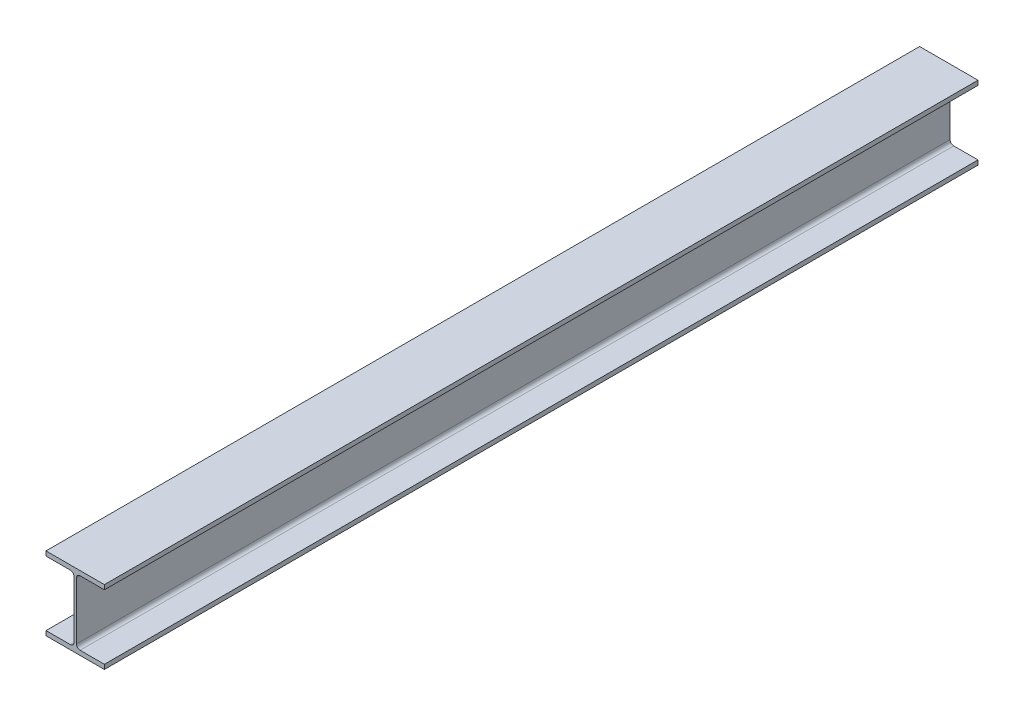
ISO-10303-21;
HEADER;
FILE_DESCRIPTION(('STEP AP214'),'2;1');
FILE_NAME('part.step','',(''),(''),'','','');
FILE_SCHEMA(('AUTOMOTIVE_DESIGN { 1 0 10303 214 1 1 1 1 }'));
ENDSEC;
DATA;
#1=APPLICATION_CONTEXT('core data for automotive mechanical design processes');
#2=APPLICATION_PROTOCOL_DEFINITION('international standard','automotive_design',2000,#1);
#3=PRODUCT_CONTEXT('',#1,'mechanical');
#4=PRODUCT('Part','Part','',(#3));
#5=PRODUCT_RELATED_PRODUCT_CATEGORY('part','',(#4));
#6=PRODUCT_DEFINITION_FORMATION('','',#4);
#7=PRODUCT_DEFINITION_CONTEXT('part definition',#1,'design');
#8=PRODUCT_DEFINITION('design','',#6,#7);
#9=PRODUCT_DEFINITION_SHAPE('','',#8);
#10=(LENGTH_UNIT() NAMED_UNIT(*) SI_UNIT(.MILLI.,.METRE.));
#11=(NAMED_UNIT(*) PLANE_ANGLE_UNIT() SI_UNIT($,.RADIAN.));
#12=(NAMED_UNIT(*) SI_UNIT($,.STERADIAN.) SOLID_ANGLE_UNIT());
#13=UNCERTAINTY_MEASURE_WITH_UNIT(LENGTH_MEASURE(1.E-05),#10,'distance_accuracy_value','');
#14=(GEOMETRIC_REPRESENTATION_CONTEXT(3) GLOBAL_UNCERTAINTY_ASSIGNED_CONTEXT((#13)) GLOBAL_UNIT_ASSIGNED_CONTEXT((#10,
#11,#12)) REPRESENTATION_CONTEXT('',''));
#15=CARTESIAN_POINT('',(0.,0.,0.));
#16=DIRECTION('',(0.,0.,1.));
#17=DIRECTION('',(1.,0.,0.));
#18=AXIS2_PLACEMENT_3D('',#15,#16,#17);
#19=CARTESIAN_POINT('',(203.708,0.,-1524.));
#20=DIRECTION('',(0.,-1.,0.));
#21=DIRECTION('',(0.,0.,-1.));
#22=AXIS2_PLACEMENT_3D('',#19,#20,#21);
#23=PLANE('',#22);
#24=DIRECTION('',(1.,0.,0.));
#25=VECTOR('',#24,1.);
#26=CARTESIAN_POINT('',(203.708,0.,1524.));
#27=LINE('',#26,#25);
#28=CARTESIAN_POINT('',(0.,0.,1524.));
#29=VERTEX_POINT('',#28);
#30=CARTESIAN_POINT('',(203.708,0.,1524.));
#31=VERTEX_POINT('',#30);
#32=EDGE_CURVE('E177',#29,#31,#27,.T.);
#33=ORIENTED_EDGE('',*,*,#32,.F.);
#34=DIRECTION('',(0.,0.,1.));
#35=VECTOR('',#34,1.);
#36=CARTESIAN_POINT('',(0.,0.,-1524.));
#37=LINE('',#36,#35);
#38=CARTESIAN_POINT('',(0.,0.,-1524.));
#39=VERTEX_POINT('',#38);
#40=EDGE_CURVE('E11',#39,#29,#37,.T.);
#41=ORIENTED_EDGE('',*,*,#40,.F.);
#42=DIRECTION('',(1.,0.,0.));
#43=VECTOR('',#42,1.);
#44=CARTESIAN_POINT('',(203.708,0.,-1524.));
#45=LINE('',#44,#43);
#46=CARTESIAN_POINT('',(203.708,0.,-1524.));
#47=VERTEX_POINT('',#46);
#48=EDGE_CURVE('E221',#39,#47,#45,.T.);
#49=ORIENTED_EDGE('',*,*,#48,.T.);
#50=DIRECTION('',(0.,0.,1.));
#51=VECTOR('',#50,1.);
#52=CARTESIAN_POINT('',(203.708,0.,-1524.));
#53=LINE('',#52,#51);
#54=EDGE_CURVE('E35',#47,#31,#53,.T.);
#55=ORIENTED_EDGE('',*,*,#54,.T.);
#56=EDGE_LOOP('',(#33,#41,#49,#55));
#57=FACE_BOUND('',#56,.T.);
#58=ADVANCED_FACE('F32',(#57),#23,.T.);
#59=CARTESIAN_POINT('',(0.,0.,-1524.));
#60=DIRECTION('',(-1.,0.,0.));
#61=DIRECTION('',(0.,-1.,0.));
#62=AXIS2_PLACEMENT_3D('',#59,#60,#61);
#63=PLANE('',#62);
#64=DIRECTION('',(0.,-1.,0.));
#65=VECTOR('',#64,1.);
#66=CARTESIAN_POINT('',(0.,0.,1524.));
#67=LINE('',#66,#65);
#68=CARTESIAN_POINT('',(0.,15.748,1524.));
#69=VERTEX_POINT('',#68);
#70=EDGE_CURVE('E219',#69,#29,#67,.T.);
#71=ORIENTED_EDGE('',*,*,#70,.F.);
#72=DIRECTION('',(0.,0.,1.));
#73=VECTOR('',#72,1.);
#74=CARTESIAN_POINT('',(0.,15.748,-1524.));
#75=LINE('',#74,#73);
#76=CARTESIAN_POINT('',(0.,15.748,-1524.));
#77=VERTEX_POINT('',#76);
#78=EDGE_CURVE('E41',#77,#69,#75,.T.);
#79=ORIENTED_EDGE('',*,*,#78,.F.);
#80=DIRECTION('',(0.,-1.,0.));
#81=VECTOR('',#80,1.);
#82=CARTESIAN_POINT('',(0.,0.,-1524.));
#83=LINE('',#82,#81);
#84=EDGE_CURVE('E167',#77,#39,#83,.T.);
#85=ORIENTED_EDGE('',*,*,#84,.T.);
#86=ORIENTED_EDGE('',*,*,#40,.T.);
#87=EDGE_LOOP('',(#71,#79,#85,#86));
#88=FACE_BOUND('',#87,.T.);
#89=ADVANCED_FACE('F249',(#88),#63,.T.);
#90=CARTESIAN_POINT('',(0.,15.748,-1524.));
#91=DIRECTION('',(0.,1.,0.));
#92=DIRECTION('',(-1.,0.,0.));
#93=AXIS2_PLACEMENT_3D('',#90,#91,#92);
#94=PLANE('',#93);
#95=DIRECTION('',(-1.,0.,0.));
#96=VECTOR('',#95,1.);
#97=CARTESIAN_POINT('',(0.,15.748,1524.));
#98=LINE('',#97,#96);
#99=CARTESIAN_POINT('',(84.709,15.748,1524.));
#100=VERTEX_POINT('',#99);
#101=EDGE_CURVE('E154',#100,#69,#98,.T.);
#102=ORIENTED_EDGE('',*,*,#101,.F.);
#103=DIRECTION('',(0.,0.,1.));
#104=VECTOR('',#103,1.);
#105=CARTESIAN_POINT('',(84.709,15.748,-1524.));
#106=LINE('',#105,#104);
#107=CARTESIAN_POINT('',(84.709,15.748,-1524.));
#108=VERTEX_POINT('',#107);
#109=EDGE_CURVE('E149',#108,#100,#106,.T.);
#110=ORIENTED_EDGE('',*,*,#109,.F.);
#111=DIRECTION('',(-1.,0.,0.));
#112=VECTOR('',#111,1.);
#113=CARTESIAN_POINT('',(0.,15.748,-1524.));
#114=LINE('',#113,#112);
#115=EDGE_CURVE('E152',#108,#77,#114,.T.);
#116=ORIENTED_EDGE('',*,*,#115,.T.);
#117=ORIENTED_EDGE('',*,*,#78,.T.);
#118=EDGE_LOOP('',(#102,#110,#116,#117));
#119=FACE_BOUND('',#118,.T.);
#120=ADVANCED_FACE('F151',(#119),#94,.T.);
#121=CARTESIAN_POINT('',(84.709,28.448,-1524.));
#122=DIRECTION('',(0.,0.,1.));
#123=DIRECTION('',(1.,0.,0.));
#124=AXIS2_PLACEMENT_3D('',#121,#122,#123);
#125=CYLINDRICAL_SURFACE('',#124,12.7);
#126=CARTESIAN_POINT('',(84.709,28.448,1524.));
#127=DIRECTION('',(0.,0.,-1.));
#128=DIRECTION('',(1.,0.,0.));
#129=AXIS2_PLACEMENT_3D('',#126,#127,#128);
#130=CIRCLE('',#129,12.7);
#131=CARTESIAN_POINT('',(97.409,28.448,1524.));
#132=VERTEX_POINT('',#131);
#133=EDGE_CURVE('E216',#132,#100,#130,.T.);
#134=ORIENTED_EDGE('',*,*,#133,.F.);
#135=DIRECTION('',(0.,0.,1.));
#136=VECTOR('',#135,1.);
#137=CARTESIAN_POINT('',(97.409,28.448,-1524.));
#138=LINE('',#137,#136);
#139=CARTESIAN_POINT('',(97.409,28.448,-1524.));
#140=VERTEX_POINT('',#139);
#141=EDGE_CURVE('E159',#140,#132,#138,.T.);
#142=ORIENTED_EDGE('',*,*,#141,.F.);
#143=CARTESIAN_POINT('',(84.709,28.448,-1524.));
#144=DIRECTION('',(0.,0.,-1.));
#145=DIRECTION('',(1.,0.,0.));
#146=AXIS2_PLACEMENT_3D('',#143,#144,#145);
#147=CIRCLE('',#146,12.7);
#148=EDGE_CURVE('E165',#140,#108,#147,.T.);
#149=ORIENTED_EDGE('',*,*,#148,.T.);
#150=ORIENTED_EDGE('',*,*,#109,.T.);
#151=EDGE_LOOP('',(#134,#142,#149,#150));
#152=FACE_BOUND('',#151,.T.);
#153=ADVANCED_FACE('F169',(#152),#125,.F.);
#154=CARTESIAN_POINT('',(97.409,28.448,-1524.));
#155=DIRECTION('',(-1.,0.,0.));
#156=DIRECTION('',(0.,-1.,0.));
#157=AXIS2_PLACEMENT_3D('',#154,#155,#156);
#158=PLANE('',#157);
#159=DIRECTION('',(0.,-1.,0.));
#160=VECTOR('',#159,1.);
#161=CARTESIAN_POINT('',(97.409,28.448,1524.));
#162=LINE('',#161,#160);
#163=CARTESIAN_POINT('',(97.4089999999999,228.092,1524.));
#164=VERTEX_POINT('',#163);
#165=EDGE_CURVE('E213',#164,#132,#162,.T.);
#166=ORIENTED_EDGE('',*,*,#165,.F.);
#167=DIRECTION('',(0.,0.,1.));
#168=VECTOR('',#167,1.);
#169=CARTESIAN_POINT('',(97.4089999999999,228.092,-1524.));
#170=LINE('',#169,#168);
#171=CARTESIAN_POINT('',(97.4089999999999,228.092,-1524.));
#172=VERTEX_POINT('',#171);
#173=EDGE_CURVE('E225',#172,#164,#170,.T.);
#174=ORIENTED_EDGE('',*,*,#173,.F.);
#175=DIRECTION('',(0.,-1.,0.));
#176=VECTOR('',#175,1.);
#177=CARTESIAN_POINT('',(97.409,28.448,-1524.));
#178=LINE('',#177,#176);
#179=EDGE_CURVE('E170',#172,#140,#178,.T.);
#180=ORIENTED_EDGE('',*,*,#179,.T.);
#181=ORIENTED_EDGE('',*,*,#141,.T.);
#182=EDGE_LOOP('',(#166,#174,#180,#181));
#183=FACE_BOUND('',#182,.T.);
#184=ADVANCED_FACE('F262',(#183),#158,.T.);
#185=CARTESIAN_POINT('',(84.7089999999999,228.092,-1524.));
#186=DIRECTION('',(0.,0.,1.));
#187=DIRECTION('',(1.,0.,0.));
#188=AXIS2_PLACEMENT_3D('',#185,#186,#187);
#189=CYLINDRICAL_SURFACE('',#188,12.7);
#190=CARTESIAN_POINT('',(84.7089999999999,228.092,1524.));
#191=DIRECTION('',(0.,0.,-1.));
#192=DIRECTION('',(1.,0.,0.));
#193=AXIS2_PLACEMENT_3D('',#190,#191,#192);
#194=CIRCLE('',#193,12.7);
#195=CARTESIAN_POINT('',(84.7089999999999,240.792,1524.));
#196=VERTEX_POINT('',#195);
#197=EDGE_CURVE('E210',#196,#164,#194,.T.);
#198=ORIENTED_EDGE('',*,*,#197,.F.);
#199=DIRECTION('',(0.,0.,1.));
#200=VECTOR('',#199,1.);
#201=CARTESIAN_POINT('',(84.7089999999999,240.792,-1524.));
#202=LINE('',#201,#200);
#203=CARTESIAN_POINT('',(84.7089999999999,240.792,-1524.));
#204=VERTEX_POINT('',#203);
#205=EDGE_CURVE('E227',#204,#196,#202,.T.);
#206=ORIENTED_EDGE('',*,*,#205,.F.);
#207=CARTESIAN_POINT('',(84.7089999999999,228.092,-1524.));
#208=DIRECTION('',(0.,0.,-1.));
#209=DIRECTION('',(1.,0.,0.));
#210=AXIS2_PLACEMENT_3D('',#207,#208,#209);
#211=CIRCLE('',#210,12.7);
#212=EDGE_CURVE('E172',#204,#172,#211,.T.);
#213=ORIENTED_EDGE('',*,*,#212,.T.);
#214=ORIENTED_EDGE('',*,*,#173,.T.);
#215=EDGE_LOOP('',(#198,#206,#213,#214));
#216=FACE_BOUND('',#215,.T.);
#217=ADVANCED_FACE('F265',(#216),#189,.F.);
#218=CARTESIAN_POINT('',(84.7089999999999,240.792,-1524.));
#219=DIRECTION('',(0.,-1.,0.));
#220=DIRECTION('',(0.,0.,-1.));
#221=AXIS2_PLACEMENT_3D('',#218,#219,#220);
#222=PLANE('',#221);
#223=DIRECTION('',(1.,0.,0.));
#224=VECTOR('',#223,1.);
#225=CARTESIAN_POINT('',(84.7089999999999,240.792,1524.));
#226=LINE('',#225,#224);
#227=CARTESIAN_POINT('',(0.,240.792,1524.));
#228=VERTEX_POINT('',#227);
#229=EDGE_CURVE('E207',#228,#196,#226,.T.);
#230=ORIENTED_EDGE('',*,*,#229,.F.);
#231=DIRECTION('',(0.,0.,1.));
#232=VECTOR('',#231,1.);
#233=CARTESIAN_POINT('',(0.,240.792,-1524.));
#234=LINE('',#233,#232);
#235=CARTESIAN_POINT('',(0.,240.792,-1524.));
#236=VERTEX_POINT('',#235);
#237=EDGE_CURVE('E229',#236,#228,#234,.T.);
#238=ORIENTED_EDGE('',*,*,#237,.F.);
#239=DIRECTION('',(1.,0.,0.));
#240=VECTOR('',#239,1.);
#241=CARTESIAN_POINT('',(84.7089999999999,240.792,-1524.));
#242=LINE('',#241,#240);
#243=EDGE_CURVE('E446',#236,#204,#242,.T.);
#244=ORIENTED_EDGE('',*,*,#243,.T.);
#245=ORIENTED_EDGE('',*,*,#205,.T.);
#246=EDGE_LOOP('',(#230,#238,#244,#245));
#247=FACE_BOUND('',#246,.T.);
#248=ADVANCED_FACE('F269',(#247),#222,.T.);
#249=CARTESIAN_POINT('',(0.,240.792,-1524.));
#250=DIRECTION('',(-1.,0.,0.));
#251=DIRECTION('',(0.,-1.,0.));
#252=AXIS2_PLACEMENT_3D('',#249,#250,#251);
#253=PLANE('',#252);
#254=DIRECTION('',(0.,-1.,0.));
#255=VECTOR('',#254,1.);
#256=CARTESIAN_POINT('',(0.,240.792,1524.));
#257=LINE('',#256,#255);
#258=CARTESIAN_POINT('',(0.,256.54,1524.));
#259=VERTEX_POINT('',#258);
#260=EDGE_CURVE('E204',#259,#228,#257,.T.);
#261=ORIENTED_EDGE('',*,*,#260,.F.);
#262=DIRECTION('',(0.,0.,1.));
#263=VECTOR('',#262,1.);
#264=CARTESIAN_POINT('',(0.,256.54,-1524.));
#265=LINE('',#264,#263);
#266=CARTESIAN_POINT('',(0.,256.54,-1524.));
#267=VERTEX_POINT('',#266);
#268=EDGE_CURVE('E231',#267,#259,#265,.T.);
#269=ORIENTED_EDGE('',*,*,#268,.F.);
#270=DIRECTION('',(0.,-1.,0.));
#271=VECTOR('',#270,1.);
#272=CARTESIAN_POINT('',(0.,240.792,-1524.));
#273=LINE('',#272,#271);
#274=EDGE_CURVE('E442',#267,#236,#273,.T.);
#275=ORIENTED_EDGE('',*,*,#274,.T.);
#276=ORIENTED_EDGE('',*,*,#237,.T.);
#277=EDGE_LOOP('',(#261,#269,#275,#276));
#278=FACE_BOUND('',#277,.T.);
#279=ADVANCED_FACE('F273',(#278),#253,.T.);
#280=CARTESIAN_POINT('',(0.,256.54,-1524.));
#281=DIRECTION('',(0.,1.,0.));
#282=DIRECTION('',(0.,0.,1.));
#283=AXIS2_PLACEMENT_3D('',#280,#281,#282);
#284=PLANE('',#283);
#285=DIRECTION('',(-1.,0.,0.));
#286=VECTOR('',#285,1.);
#287=CARTESIAN_POINT('',(0.,256.54,1524.));
#288=LINE('',#287,#286);
#289=CARTESIAN_POINT('',(203.708,256.54,1524.));
#290=VERTEX_POINT('',#289);
#291=EDGE_CURVE('E201',#290,#259,#288,.T.);
#292=ORIENTED_EDGE('',*,*,#291,.F.);
#293=DIRECTION('',(0.,0.,1.));
#294=VECTOR('',#293,1.);
#295=CARTESIAN_POINT('',(203.708,256.54,-1524.));
#296=LINE('',#295,#294);
#297=CARTESIAN_POINT('',(203.708,256.54,-1524.));
#298=VERTEX_POINT('',#297);
#299=EDGE_CURVE('E233',#298,#290,#296,.T.);
#300=ORIENTED_EDGE('',*,*,#299,.F.);
#301=DIRECTION('',(-1.,0.,0.));
#302=VECTOR('',#301,1.);
#303=CARTESIAN_POINT('',(0.,256.54,-1524.));
#304=LINE('',#303,#302);
#305=EDGE_CURVE('E453',#298,#267,#304,.T.);
#306=ORIENTED_EDGE('',*,*,#305,.T.);
#307=ORIENTED_EDGE('',*,*,#268,.T.);
#308=EDGE_LOOP('',(#292,#300,#306,#307));
#309=FACE_BOUND('',#308,.T.);
#310=ADVANCED_FACE('F277',(#309),#284,.T.);
#311=CARTESIAN_POINT('',(203.708,256.54,-1524.));
#312=DIRECTION('',(1.,0.,0.));
#313=DIRECTION('',(0.,1.,0.));
#314=AXIS2_PLACEMENT_3D('',#311,#312,#313);
#315=PLANE('',#314);
#316=DIRECTION('',(0.,1.,0.));
#317=VECTOR('',#316,1.);
#318=CARTESIAN_POINT('',(203.708,256.54,1524.));
#319=LINE('',#318,#317);
#320=CARTESIAN_POINT('',(203.708,240.792,1524.));
#321=VERTEX_POINT('',#320);
#322=EDGE_CURVE('E198',#321,#290,#319,.T.);
#323=ORIENTED_EDGE('',*,*,#322,.F.);
#324=DIRECTION('',(0.,0.,1.));
#325=VECTOR('',#324,1.);
#326=CARTESIAN_POINT('',(203.708,240.792,-1524.));
#327=LINE('',#326,#325);
#328=CARTESIAN_POINT('',(203.708,240.792,-1524.));
#329=VERTEX_POINT('',#328);
#330=EDGE_CURVE('E235',#329,#321,#327,.T.);
#331=ORIENTED_EDGE('',*,*,#330,.F.);
#332=DIRECTION('',(0.,1.,0.));
#333=VECTOR('',#332,1.);
#334=CARTESIAN_POINT('',(203.708,256.54,-1524.));
#335=LINE('',#334,#333);
#336=EDGE_CURVE('E435',#329,#298,#335,.T.);
#337=ORIENTED_EDGE('',*,*,#336,.T.);
#338=ORIENTED_EDGE('',*,*,#299,.T.);
#339=EDGE_LOOP('',(#323,#331,#337,#338));
#340=FACE_BOUND('',#339,.T.);
#341=ADVANCED_FACE('F281',(#340),#315,.T.);
#342=CARTESIAN_POINT('',(203.708,240.792,-1524.));
#343=DIRECTION('',(0.,-1.,0.));
#344=DIRECTION('',(0.,0.,-1.));
#345=AXIS2_PLACEMENT_3D('',#342,#343,#344);
#346=PLANE('',#345);
#347=DIRECTION('',(1.,0.,0.));
#348=VECTOR('',#347,1.);
#349=CARTESIAN_POINT('',(203.708,240.792,1524.));
#350=LINE('',#349,#348);
#351=CARTESIAN_POINT('',(118.999,240.792,1524.));
#352=VERTEX_POINT('',#351);
#353=EDGE_CURVE('E195',#352,#321,#350,.T.);
#354=ORIENTED_EDGE('',*,*,#353,.F.);
#355=DIRECTION('',(0.,0.,1.));
#356=VECTOR('',#355,1.);
#357=CARTESIAN_POINT('',(118.999,240.792,-1524.));
#358=LINE('',#357,#356);
#359=CARTESIAN_POINT('',(118.999,240.792,-1524.));
#360=VERTEX_POINT('',#359);
#361=EDGE_CURVE('E237',#360,#352,#358,.T.);
#362=ORIENTED_EDGE('',*,*,#361,.F.);
#363=DIRECTION('',(1.,0.,0.));
#364=VECTOR('',#363,1.);
#365=CARTESIAN_POINT('',(203.708,240.792,-1524.));
#366=LINE('',#365,#364);
#367=EDGE_CURVE('E431',#360,#329,#366,.T.);
#368=ORIENTED_EDGE('',*,*,#367,.T.);
#369=ORIENTED_EDGE('',*,*,#330,.T.);
#370=EDGE_LOOP('',(#354,#362,#368,#369));
#371=FACE_BOUND('',#370,.T.);
#372=ADVANCED_FACE('F285',(#371),#346,.T.);
#373=CARTESIAN_POINT('',(118.999,228.092,-1524.));
#374=DIRECTION('',(0.,0.,1.));
#375=DIRECTION('',(1.,0.,0.));
#376=AXIS2_PLACEMENT_3D('',#373,#374,#375);
#377=CYLINDRICAL_SURFACE('',#376,12.7);
#378=CARTESIAN_POINT('',(118.999,228.092,1524.));
#379=DIRECTION('',(0.,0.,-1.));
#380=DIRECTION('',(1.,0.,0.));
#381=AXIS2_PLACEMENT_3D('',#378,#379,#380);
#382=CIRCLE('',#381,12.7);
#383=CARTESIAN_POINT('',(106.299,228.092,1524.));
#384=VERTEX_POINT('',#383);
#385=EDGE_CURVE('E192',#384,#352,#382,.T.);
#386=ORIENTED_EDGE('',*,*,#385,.F.);
#387=DIRECTION('',(0.,0.,1.));
#388=VECTOR('',#387,1.);
#389=CARTESIAN_POINT('',(106.299,228.092,-1524.));
#390=LINE('',#389,#388);
#391=CARTESIAN_POINT('',(106.299,228.092,-1524.));
#392=VERTEX_POINT('',#391);
#393=EDGE_CURVE('E239',#392,#384,#390,.T.);
#394=ORIENTED_EDGE('',*,*,#393,.F.);
#395=CARTESIAN_POINT('',(118.999,228.092,-1524.));
#396=DIRECTION('',(0.,0.,-1.));
#397=DIRECTION('',(1.,0.,0.));
#398=AXIS2_PLACEMENT_3D('',#395,#396,#397);
#399=CIRCLE('',#398,12.7);
#400=EDGE_CURVE('E457',#392,#360,#399,.T.);
#401=ORIENTED_EDGE('',*,*,#400,.T.);
#402=ORIENTED_EDGE('',*,*,#361,.T.);
#403=EDGE_LOOP('',(#386,#394,#401,#402));
#404=FACE_BOUND('',#403,.T.);
#405=ADVANCED_FACE('F289',(#404),#377,.F.);
#406=CARTESIAN_POINT('',(106.299,228.092,-1524.));
#407=DIRECTION('',(1.,0.,0.));
#408=DIRECTION('',(0.,1.,0.));
#409=AXIS2_PLACEMENT_3D('',#406,#407,#408);
#410=PLANE('',#409);
#411=DIRECTION('',(0.,1.,0.));
#412=VECTOR('',#411,1.);
#413=CARTESIAN_POINT('',(106.299,228.092,1524.));
#414=LINE('',#413,#412);
#415=CARTESIAN_POINT('',(106.299,28.448,1524.));
#416=VERTEX_POINT('',#415);
#417=EDGE_CURVE('E189',#416,#384,#414,.T.);
#418=ORIENTED_EDGE('',*,*,#417,.F.);
#419=DIRECTION('',(0.,0.,1.));
#420=VECTOR('',#419,1.);
#421=CARTESIAN_POINT('',(106.299,28.448,-1524.));
#422=LINE('',#421,#420);
#423=CARTESIAN_POINT('',(106.299,28.448,-1524.));
#424=VERTEX_POINT('',#423);
#425=EDGE_CURVE('E241',#424,#416,#422,.T.);
#426=ORIENTED_EDGE('',*,*,#425,.F.);
#427=DIRECTION('',(0.,1.,0.));
#428=VECTOR('',#427,1.);
#429=CARTESIAN_POINT('',(106.299,228.092,-1524.));
#430=LINE('',#429,#428);
#431=EDGE_CURVE('E424',#424,#392,#430,.T.);
#432=ORIENTED_EDGE('',*,*,#431,.T.);
#433=ORIENTED_EDGE('',*,*,#393,.T.);
#434=EDGE_LOOP('',(#418,#426,#432,#433));
#435=FACE_BOUND('',#434,.T.);
#436=ADVANCED_FACE('F293',(#435),#410,.T.);
#437=CARTESIAN_POINT('',(118.999,28.448,-1524.));
#438=DIRECTION('',(0.,0.,1.));
#439=DIRECTION('',(1.,0.,0.));
#440=AXIS2_PLACEMENT_3D('',#437,#438,#439);
#441=CYLINDRICAL_SURFACE('',#440,12.7);
#442=CARTESIAN_POINT('',(118.999,28.448,1524.));
#443=DIRECTION('',(0.,0.,-1.));
#444=DIRECTION('',(1.,0.,0.));
#445=AXIS2_PLACEMENT_3D('',#442,#443,#444);
#446=CIRCLE('',#445,12.7);
#447=CARTESIAN_POINT('',(118.999,15.748,1524.));
#448=VERTEX_POINT('',#447);
#449=EDGE_CURVE('E186',#448,#416,#446,.T.);
#450=ORIENTED_EDGE('',*,*,#449,.F.);
#451=DIRECTION('',(0.,0.,1.));
#452=VECTOR('',#451,1.);
#453=CARTESIAN_POINT('',(118.999,15.748,-1524.));
#454=LINE('',#453,#452);
#455=CARTESIAN_POINT('',(118.999,15.748,-1524.));
#456=VERTEX_POINT('',#455);
#457=EDGE_CURVE('E243',#456,#448,#454,.T.);
#458=ORIENTED_EDGE('',*,*,#457,.F.);
#459=CARTESIAN_POINT('',(118.999,28.448,-1524.));
#460=DIRECTION('',(0.,0.,-1.));
#461=DIRECTION('',(1.,0.,0.));
#462=AXIS2_PLACEMENT_3D('',#459,#460,#461);
#463=CIRCLE('',#462,12.7);
#464=EDGE_CURVE('E420',#456,#424,#463,.T.);
#465=ORIENTED_EDGE('',*,*,#464,.T.);
#466=ORIENTED_EDGE('',*,*,#425,.T.);
#467=EDGE_LOOP('',(#450,#458,#465,#466));
#468=FACE_BOUND('',#467,.T.);
#469=ADVANCED_FACE('F297',(#468),#441,.F.);
#470=CARTESIAN_POINT('',(118.999,15.748,-1524.));
#471=DIRECTION('',(0.,1.,0.));
#472=DIRECTION('',(-1.,0.,0.));
#473=AXIS2_PLACEMENT_3D('',#470,#471,#472);
#474=PLANE('',#473);
#475=DIRECTION('',(-1.,0.,0.));
#476=VECTOR('',#475,1.);
#477=CARTESIAN_POINT('',(118.999,15.748,1524.));
#478=LINE('',#477,#476);
#479=CARTESIAN_POINT('',(203.708,15.748,1524.));
#480=VERTEX_POINT('',#479);
#481=EDGE_CURVE('E183',#480,#448,#478,.T.);
#482=ORIENTED_EDGE('',*,*,#481,.F.);
#483=DIRECTION('',(0.,0.,1.));
#484=VECTOR('',#483,1.);
#485=CARTESIAN_POINT('',(203.708,15.748,-1524.));
#486=LINE('',#485,#484);
#487=CARTESIAN_POINT('',(203.708,15.748,-1524.));
#488=VERTEX_POINT('',#487);
#489=EDGE_CURVE('E244',#488,#480,#486,.T.);
#490=ORIENTED_EDGE('',*,*,#489,.F.);
#491=DIRECTION('',(-1.,0.,0.));
#492=VECTOR('',#491,1.);
#493=CARTESIAN_POINT('',(118.999,15.748,-1524.));
#494=LINE('',#493,#492);
#495=EDGE_CURVE('E461',#488,#456,#494,.T.);
#496=ORIENTED_EDGE('',*,*,#495,.T.);
#497=ORIENTED_EDGE('',*,*,#457,.T.);
#498=EDGE_LOOP('',(#482,#490,#496,#497));
#499=FACE_BOUND('',#498,.T.);
#500=ADVANCED_FACE('F301',(#499),#474,.T.);
#501=CARTESIAN_POINT('',(203.708,15.748,-1524.));
#502=DIRECTION('',(1.,0.,0.));
#503=DIRECTION('',(0.,0.,-1.));
#504=AXIS2_PLACEMENT_3D('',#501,#502,#503);
#505=PLANE('',#504);
#506=DIRECTION('',(0.,1.,0.));
#507=VECTOR('',#506,1.);
#508=CARTESIAN_POINT('',(203.708,15.748,1524.));
#509=LINE('',#508,#507);
#510=EDGE_CURVE('E180',#31,#480,#509,.T.);
#511=ORIENTED_EDGE('',*,*,#510,.F.);
#512=ORIENTED_EDGE('',*,*,#54,.F.);
#513=DIRECTION('',(0.,1.,0.));
#514=VECTOR('',#513,1.);
#515=CARTESIAN_POINT('',(203.708,15.748,-1524.));
#516=LINE('',#515,#514);
#517=EDGE_CURVE('E463',#47,#488,#516,.T.);
#518=ORIENTED_EDGE('',*,*,#517,.T.);
#519=ORIENTED_EDGE('',*,*,#489,.T.);
#520=EDGE_LOOP('',(#511,#512,#518,#519));
#521=FACE_BOUND('',#520,.T.);
#522=ADVANCED_FACE('F246',(#521),#505,.T.);
#523=CARTESIAN_POINT('',(84.709,28.448,-1524.));
#524=DIRECTION('',(0.,0.,1.));
#525=DIRECTION('',(1.,0.,0.));
#526=AXIS2_PLACEMENT_3D('',#523,#524,#525);
#527=PLANE('',#526);
#528=ORIENTED_EDGE('',*,*,#48,.F.);
#529=ORIENTED_EDGE('',*,*,#84,.F.);
#530=ORIENTED_EDGE('',*,*,#115,.F.);
#531=ORIENTED_EDGE('',*,*,#148,.F.);
#532=ORIENTED_EDGE('',*,*,#179,.F.);
#533=ORIENTED_EDGE('',*,*,#212,.F.);
#534=ORIENTED_EDGE('',*,*,#243,.F.);
#535=ORIENTED_EDGE('',*,*,#274,.F.);
#536=ORIENTED_EDGE('',*,*,#305,.F.);
#537=ORIENTED_EDGE('',*,*,#336,.F.);
#538=ORIENTED_EDGE('',*,*,#367,.F.);
#539=ORIENTED_EDGE('',*,*,#400,.F.);
#540=ORIENTED_EDGE('',*,*,#431,.F.);
#541=ORIENTED_EDGE('',*,*,#464,.F.);
#542=ORIENTED_EDGE('',*,*,#495,.F.);
#543=ORIENTED_EDGE('',*,*,#517,.F.);
#544=EDGE_LOOP('',(#528,#529,#530,#531,#532,#533,#534,#535,#536,#537,#538,#539,#540,#541,#542,#543));
#545=FACE_BOUND('',#544,.T.);
#546=ADVANCED_FACE('F163',(#545),#527,.F.);
#547=CARTESIAN_POINT('',(84.709,28.448,1524.));
#548=DIRECTION('',(0.,0.,1.));
#549=DIRECTION('',(1.,0.,0.));
#550=AXIS2_PLACEMENT_3D('',#547,#548,#549);
#551=PLANE('',#550);
#552=ORIENTED_EDGE('',*,*,#32,.T.);
#553=ORIENTED_EDGE('',*,*,#510,.T.);
#554=ORIENTED_EDGE('',*,*,#481,.T.);
#555=ORIENTED_EDGE('',*,*,#449,.T.);
#556=ORIENTED_EDGE('',*,*,#417,.T.);
#557=ORIENTED_EDGE('',*,*,#385,.T.);
#558=ORIENTED_EDGE('',*,*,#353,.T.);
#559=ORIENTED_EDGE('',*,*,#322,.T.);
#560=ORIENTED_EDGE('',*,*,#291,.T.);
#561=ORIENTED_EDGE('',*,*,#260,.T.);
#562=ORIENTED_EDGE('',*,*,#229,.T.);
#563=ORIENTED_EDGE('',*,*,#197,.T.);
#564=ORIENTED_EDGE('',*,*,#165,.T.);
#565=ORIENTED_EDGE('',*,*,#133,.T.);
#566=ORIENTED_EDGE('',*,*,#101,.T.);
#567=ORIENTED_EDGE('',*,*,#70,.T.);
#568=EDGE_LOOP('',(#552,#553,#554,#555,#556,#557,#558,#559,#560,#561,#562,#563,#564,#565,#566,#567));
#569=FACE_BOUND('',#568,.T.);
#570=ADVANCED_FACE('F248',(#569),#551,.T.);
#571=CLOSED_SHELL('',(#58,#89,#120,#153,#184,#217,#248,#279,#310,#341,#372,#405,#436,#469,#500,
#522,#546,#570));
#572=MANIFOLD_SOLID_BREP('B2',#571);
#573=ADVANCED_BREP_SHAPE_REPRESENTATION('',(#18,#572),#14);
#574=SHAPE_DEFINITION_REPRESENTATION(#9,#573);
ENDSEC;
END-ISO-10303-21;
